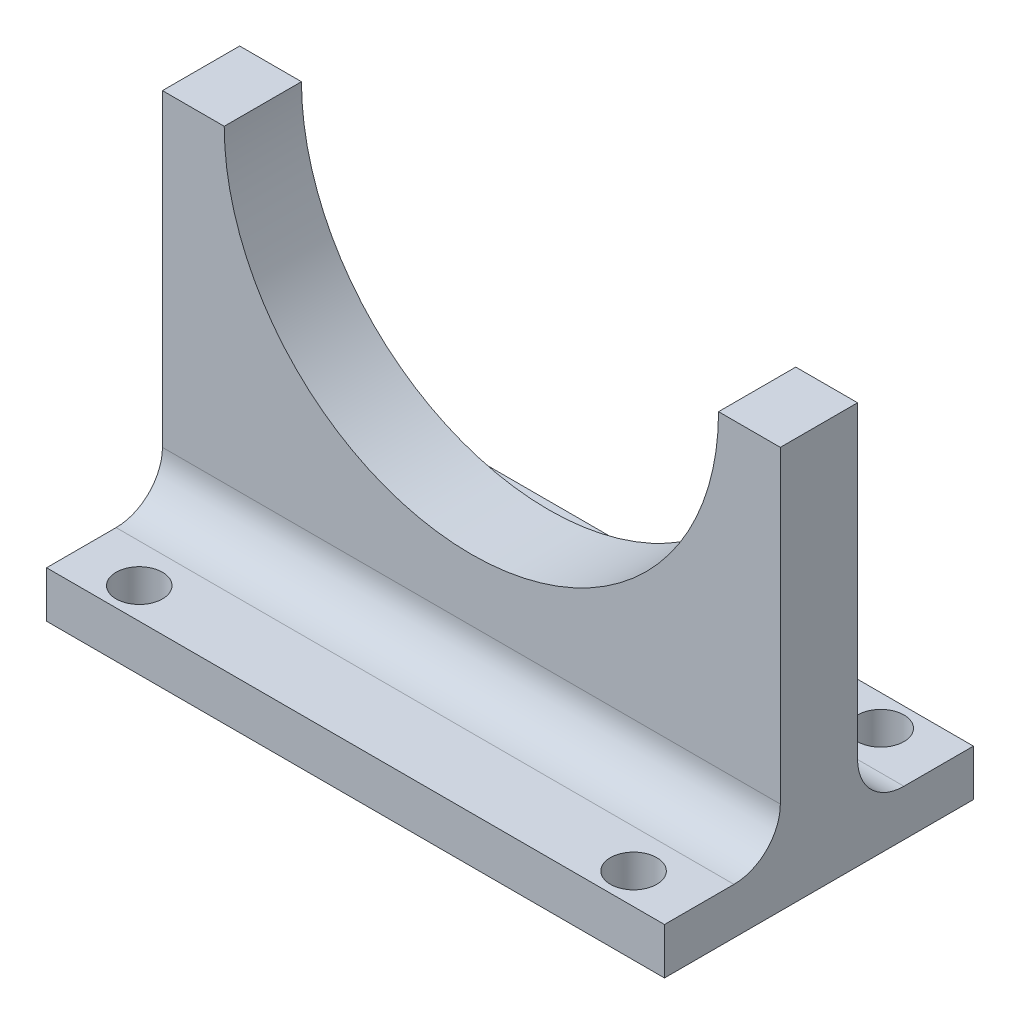
ISO-10303-21;
HEADER;
FILE_DESCRIPTION(('STEP AP214'),'2;1');
FILE_NAME('part.step','',(''),(''),'','','');
FILE_SCHEMA(('AUTOMOTIVE_DESIGN { 1 0 10303 214 1 1 1 1 }'));
ENDSEC;
DATA;
#1=APPLICATION_CONTEXT('core data for automotive mechanical design processes');
#2=APPLICATION_PROTOCOL_DEFINITION('international standard','automotive_design',2000,#1);
#3=PRODUCT_CONTEXT('',#1,'mechanical');
#4=PRODUCT('Part','Part','',(#3));
#5=PRODUCT_RELATED_PRODUCT_CATEGORY('part','',(#4));
#6=PRODUCT_DEFINITION_FORMATION('','',#4);
#7=PRODUCT_DEFINITION_CONTEXT('part definition',#1,'design');
#8=PRODUCT_DEFINITION('design','',#6,#7);
#9=PRODUCT_DEFINITION_SHAPE('','',#8);
#10=(LENGTH_UNIT() NAMED_UNIT(*) SI_UNIT(.MILLI.,.METRE.));
#11=(NAMED_UNIT(*) PLANE_ANGLE_UNIT() SI_UNIT($,.RADIAN.));
#12=(NAMED_UNIT(*) SI_UNIT($,.STERADIAN.) SOLID_ANGLE_UNIT());
#13=UNCERTAINTY_MEASURE_WITH_UNIT(LENGTH_MEASURE(1.E-05),#10,'distance_accuracy_value','');
#14=(GEOMETRIC_REPRESENTATION_CONTEXT(3) GLOBAL_UNCERTAINTY_ASSIGNED_CONTEXT((#13)) GLOBAL_UNIT_ASSIGNED_CONTEXT((#10,
#11,#12)) REPRESENTATION_CONTEXT('',''));
#15=CARTESIAN_POINT('',(0.,0.,0.));
#16=DIRECTION('',(0.,0.,1.));
#17=DIRECTION('',(1.,0.,0.));
#18=AXIS2_PLACEMENT_3D('',#15,#16,#17);
#19=CARTESIAN_POINT('',(-20.,13.,-2.5));
#20=DIRECTION('',(0.,1.,0.));
#21=DIRECTION('',(0.,0.,1.));
#22=AXIS2_PLACEMENT_3D('',#19,#20,#21);
#23=PLANE('',#22);
#24=DIRECTION('',(0.,0.,-1.));
#25=VECTOR('',#24,1.);
#26=CARTESIAN_POINT('',(16.,13.,2.5));
#27=LINE('',#26,#25);
#28=CARTESIAN_POINT('',(16.,13.,2.5));
#29=VERTEX_POINT('',#28);
#30=CARTESIAN_POINT('',(16.,13.,-2.5));
#31=VERTEX_POINT('',#30);
#32=EDGE_CURVE('E176',#29,#31,#27,.T.);
#33=ORIENTED_EDGE('',*,*,#32,.F.);
#34=DIRECTION('',(-1.,0.,0.));
#35=VECTOR('',#34,1.);
#36=CARTESIAN_POINT('',(-20.,13.,2.5));
#37=LINE('',#36,#35);
#38=CARTESIAN_POINT('',(20.,13.,2.5));
#39=VERTEX_POINT('',#38);
#40=EDGE_CURVE('E181',#39,#29,#37,.T.);
#41=ORIENTED_EDGE('',*,*,#40,.F.);
#42=DIRECTION('',(0.,0.,1.));
#43=VECTOR('',#42,1.);
#44=CARTESIAN_POINT('',(20.,13.,-2.5));
#45=LINE('',#44,#43);
#46=CARTESIAN_POINT('',(20.,13.,-2.5));
#47=VERTEX_POINT('',#46);
#48=EDGE_CURVE('E194',#47,#39,#45,.T.);
#49=ORIENTED_EDGE('',*,*,#48,.F.);
#50=DIRECTION('',(-1.,0.,0.));
#51=VECTOR('',#50,1.);
#52=CARTESIAN_POINT('',(-20.,13.,-2.5));
#53=LINE('',#52,#51);
#54=EDGE_CURVE('E189',#47,#31,#53,.T.);
#55=ORIENTED_EDGE('',*,*,#54,.T.);
#56=EDGE_LOOP('',(#33,#41,#49,#55));
#57=FACE_BOUND('',#56,.T.);
#58=ADVANCED_FACE('F33',(#57),#23,.T.);
#59=CARTESIAN_POINT('',(20.,13.,-2.5));
#60=DIRECTION('',(1.,0.,0.));
#61=DIRECTION('',(0.,1.,0.));
#62=AXIS2_PLACEMENT_3D('',#59,#60,#61);
#63=PLANE('',#62);
#64=DIRECTION('',(0.,1.,0.));
#65=VECTOR('',#64,1.);
#66=CARTESIAN_POINT('',(20.,13.,2.5));
#67=LINE('',#66,#65);
#68=CARTESIAN_POINT('',(20.,-6.99999999999999,2.5));
#69=VERTEX_POINT('',#68);
#70=EDGE_CURVE('E178',#69,#39,#67,.T.);
#71=ORIENTED_EDGE('',*,*,#70,.F.);
#72=CARTESIAN_POINT('',(20.,-7.,5.5));
#73=DIRECTION('',(1.,0.,0.));
#74=DIRECTION('',(0.,1.,0.));
#75=AXIS2_PLACEMENT_3D('',#72,#73,#74);
#76=CIRCLE('',#75,3.);
#77=CARTESIAN_POINT('',(20.,-10.,5.5));
#78=VERTEX_POINT('',#77);
#79=EDGE_CURVE('E11',#69,#78,#76,.F.);
#80=ORIENTED_EDGE('',*,*,#79,.T.);
#81=DIRECTION('',(0.,0.,1.));
#82=VECTOR('',#81,1.);
#83=CARTESIAN_POINT('',(20.,-10.,-10.));
#84=LINE('',#83,#82);
#85=CARTESIAN_POINT('',(20.,-10.,10.));
#86=VERTEX_POINT('',#85);
#87=EDGE_CURVE('E164',#78,#86,#84,.T.);
#88=ORIENTED_EDGE('',*,*,#87,.T.);
#89=DIRECTION('',(0.,1.,0.));
#90=VECTOR('',#89,1.);
#91=CARTESIAN_POINT('',(20.,-10.,10.));
#92=LINE('',#91,#90);
#93=CARTESIAN_POINT('',(20.,-13.,10.));
#94=VERTEX_POINT('',#93);
#95=EDGE_CURVE('E140',#94,#86,#92,.T.);
#96=ORIENTED_EDGE('',*,*,#95,.F.);
#97=DIRECTION('',(0.,0.,1.));
#98=VECTOR('',#97,1.);
#99=CARTESIAN_POINT('',(20.,-13.,-2.5));
#100=LINE('',#99,#98);
#101=CARTESIAN_POINT('',(20.,-13.,-10.));
#102=VERTEX_POINT('',#101);
#103=EDGE_CURVE('E131',#102,#94,#100,.T.);
#104=ORIENTED_EDGE('',*,*,#103,.F.);
#105=DIRECTION('',(0.,1.,0.));
#106=VECTOR('',#105,1.);
#107=CARTESIAN_POINT('',(20.,-10.,-10.));
#108=LINE('',#107,#106);
#109=CARTESIAN_POINT('',(20.,-10.,-10.));
#110=VERTEX_POINT('',#109);
#111=EDGE_CURVE('E158',#102,#110,#108,.T.);
#112=ORIENTED_EDGE('',*,*,#111,.T.);
#113=CARTESIAN_POINT('',(20.,-10.,-5.5));
#114=VERTEX_POINT('',#113);
#115=EDGE_CURVE('E170',#110,#114,#84,.T.);
#116=ORIENTED_EDGE('',*,*,#115,.T.);
#117=CARTESIAN_POINT('',(20.,-7.,-5.5));
#118=DIRECTION('',(1.,0.,0.));
#119=DIRECTION('',(0.,1.,0.));
#120=AXIS2_PLACEMENT_3D('',#117,#118,#119);
#121=CIRCLE('',#120,3.);
#122=CARTESIAN_POINT('',(20.,-6.99999999999999,-2.5));
#123=VERTEX_POINT('',#122);
#124=EDGE_CURVE('E213',#114,#123,#121,.F.);
#125=ORIENTED_EDGE('',*,*,#124,.T.);
#126=DIRECTION('',(0.,1.,0.));
#127=VECTOR('',#126,1.);
#128=CARTESIAN_POINT('',(20.,13.,-2.5));
#129=LINE('',#128,#127);
#130=EDGE_CURVE('E186',#123,#47,#129,.T.);
#131=ORIENTED_EDGE('',*,*,#130,.T.);
#132=ORIENTED_EDGE('',*,*,#48,.T.);
#133=EDGE_LOOP('',(#71,#80,#88,#96,#104,#112,#116,#125,#131,#132));
#134=FACE_BOUND('',#133,.T.);
#135=ADVANCED_FACE('F217',(#134),#63,.T.);
#136=CARTESIAN_POINT('',(-20.,-13.,-2.5));
#137=DIRECTION('',(0.,-1.,0.));
#138=DIRECTION('',(0.,0.,-1.));
#139=AXIS2_PLACEMENT_3D('',#136,#137,#138);
#140=PLANE('',#139);
#141=CARTESIAN_POINT('',(-16.,-13.,8.));
#142=DIRECTION('',(0.,1.,0.));
#143=DIRECTION('',(0.,0.,-1.));
#144=AXIS2_PLACEMENT_3D('',#141,#142,#143);
#145=CIRCLE('',#144,1.5);
#146=CARTESIAN_POINT('',(-16.,-13.,6.5));
#147=VERTEX_POINT('',#146);
#148=EDGE_CURVE('E363',#147,#147,#145,.T.);
#149=ORIENTED_EDGE('',*,*,#148,.T.);
#150=EDGE_LOOP('',(#149));
#151=FACE_BOUND('',#150,.T.);
#152=CARTESIAN_POINT('',(-16.,-13.,-8.));
#153=DIRECTION('',(0.,-1.,0.));
#154=DIRECTION('',(0.,0.,1.));
#155=AXIS2_PLACEMENT_3D('',#152,#153,#154);
#156=CIRCLE('',#155,1.5);
#157=CARTESIAN_POINT('',(-16.,-13.,-6.5));
#158=VERTEX_POINT('',#157);
#159=EDGE_CURVE('E371',#158,#158,#156,.T.);
#160=ORIENTED_EDGE('',*,*,#159,.F.);
#161=EDGE_LOOP('',(#160));
#162=FACE_BOUND('',#161,.T.);
#163=CARTESIAN_POINT('',(16.,-13.,8.));
#164=DIRECTION('',(0.,-1.,0.));
#165=DIRECTION('',(0.,0.,-1.));
#166=AXIS2_PLACEMENT_3D('',#163,#164,#165);
#167=CIRCLE('',#166,1.5);
#168=CARTESIAN_POINT('',(16.,-13.,6.5));
#169=VERTEX_POINT('',#168);
#170=EDGE_CURVE('E377',#169,#169,#167,.T.);
#171=ORIENTED_EDGE('',*,*,#170,.F.);
#172=EDGE_LOOP('',(#171));
#173=FACE_BOUND('',#172,.T.);
#174=CARTESIAN_POINT('',(16.,-13.,-8.));
#175=DIRECTION('',(0.,1.,0.));
#176=DIRECTION('',(0.,0.,1.));
#177=AXIS2_PLACEMENT_3D('',#174,#175,#176);
#178=CIRCLE('',#177,1.5);
#179=CARTESIAN_POINT('',(16.,-13.,-6.5));
#180=VERTEX_POINT('',#179);
#181=EDGE_CURVE('E146',#180,#180,#178,.T.);
#182=ORIENTED_EDGE('',*,*,#181,.T.);
#183=EDGE_LOOP('',(#182));
#184=FACE_BOUND('',#183,.T.);
#185=ORIENTED_EDGE('',*,*,#103,.T.);
#186=DIRECTION('',(1.,0.,0.));
#187=VECTOR('',#186,1.);
#188=CARTESIAN_POINT('',(-20.,-13.,10.));
#189=LINE('',#188,#187);
#190=CARTESIAN_POINT('',(-20.,-13.,10.));
#191=VERTEX_POINT('',#190);
#192=EDGE_CURVE('E135',#191,#94,#189,.T.);
#193=ORIENTED_EDGE('',*,*,#192,.F.);
#194=DIRECTION('',(0.,0.,1.));
#195=VECTOR('',#194,1.);
#196=CARTESIAN_POINT('',(-20.,-13.,-2.5));
#197=LINE('',#196,#195);
#198=CARTESIAN_POINT('',(-20.,-13.,-10.));
#199=VERTEX_POINT('',#198);
#200=EDGE_CURVE('E120',#199,#191,#197,.T.);
#201=ORIENTED_EDGE('',*,*,#200,.F.);
#202=DIRECTION('',(1.,0.,0.));
#203=VECTOR('',#202,1.);
#204=CARTESIAN_POINT('',(-20.,-13.,-10.));
#205=LINE('',#204,#203);
#206=EDGE_CURVE('E156',#199,#102,#205,.T.);
#207=ORIENTED_EDGE('',*,*,#206,.T.);
#208=EDGE_LOOP('',(#185,#193,#201,#207));
#209=FACE_BOUND('',#208,.T.);
#210=ADVANCED_FACE('F136',(#151,#162,#173,#184,#209),#140,.T.);
#211=CARTESIAN_POINT('',(-20.,13.,-2.5));
#212=DIRECTION('',(-1.,0.,0.));
#213=DIRECTION('',(0.,-1.,0.));
#214=AXIS2_PLACEMENT_3D('',#211,#212,#213);
#215=PLANE('',#214);
#216=DIRECTION('',(0.,-1.,0.));
#217=VECTOR('',#216,1.);
#218=CARTESIAN_POINT('',(-20.,13.,-2.5));
#219=LINE('',#218,#217);
#220=CARTESIAN_POINT('',(-20.,13.,-2.5));
#221=VERTEX_POINT('',#220);
#222=CARTESIAN_POINT('',(-20.,-6.99999999999999,-2.5));
#223=VERTEX_POINT('',#222);
#224=EDGE_CURVE('E192',#221,#223,#219,.T.);
#225=ORIENTED_EDGE('',*,*,#224,.T.);
#226=CARTESIAN_POINT('',(-20.,-7.,-5.5));
#227=DIRECTION('',(-1.,0.,0.));
#228=DIRECTION('',(0.,-1.,0.));
#229=AXIS2_PLACEMENT_3D('',#226,#227,#228);
#230=CIRCLE('',#229,3.);
#231=CARTESIAN_POINT('',(-20.,-10.,-5.5));
#232=VERTEX_POINT('',#231);
#233=EDGE_CURVE('E211',#223,#232,#230,.F.);
#234=ORIENTED_EDGE('',*,*,#233,.T.);
#235=DIRECTION('',(0.,0.,1.));
#236=VECTOR('',#235,1.);
#237=CARTESIAN_POINT('',(-20.,-10.,-10.));
#238=LINE('',#237,#236);
#239=CARTESIAN_POINT('',(-20.,-10.,-10.));
#240=VERTEX_POINT('',#239);
#241=EDGE_CURVE('E165',#240,#232,#238,.T.);
#242=ORIENTED_EDGE('',*,*,#241,.F.);
#243=DIRECTION('',(0.,-1.,0.));
#244=VECTOR('',#243,1.);
#245=CARTESIAN_POINT('',(-20.,-10.,-10.));
#246=LINE('',#245,#244);
#247=EDGE_CURVE('E127',#240,#199,#246,.T.);
#248=ORIENTED_EDGE('',*,*,#247,.T.);
#249=ORIENTED_EDGE('',*,*,#200,.T.);
#250=DIRECTION('',(0.,-1.,0.));
#251=VECTOR('',#250,1.);
#252=CARTESIAN_POINT('',(-20.,-10.,10.));
#253=LINE('',#252,#251);
#254=CARTESIAN_POINT('',(-20.,-10.,10.));
#255=VERTEX_POINT('',#254);
#256=EDGE_CURVE('E125',#255,#191,#253,.T.);
#257=ORIENTED_EDGE('',*,*,#256,.F.);
#258=CARTESIAN_POINT('',(-20.,-10.,5.5));
#259=VERTEX_POINT('',#258);
#260=EDGE_CURVE('E169',#259,#255,#238,.T.);
#261=ORIENTED_EDGE('',*,*,#260,.F.);
#262=CARTESIAN_POINT('',(-20.,-7.,5.5));
#263=DIRECTION('',(-1.,0.,0.));
#264=DIRECTION('',(0.,-1.,0.));
#265=AXIS2_PLACEMENT_3D('',#262,#263,#264);
#266=CIRCLE('',#265,3.);
#267=CARTESIAN_POINT('',(-20.,-6.99999999999999,2.5));
#268=VERTEX_POINT('',#267);
#269=EDGE_CURVE('E41',#259,#268,#266,.F.);
#270=ORIENTED_EDGE('',*,*,#269,.T.);
#271=DIRECTION('',(0.,-1.,0.));
#272=VECTOR('',#271,1.);
#273=CARTESIAN_POINT('',(-20.,13.,2.5));
#274=LINE('',#273,#272);
#275=CARTESIAN_POINT('',(-20.,13.,2.5));
#276=VERTEX_POINT('',#275);
#277=EDGE_CURVE('E184',#276,#268,#274,.T.);
#278=ORIENTED_EDGE('',*,*,#277,.F.);
#279=DIRECTION('',(0.,0.,1.));
#280=VECTOR('',#279,1.);
#281=CARTESIAN_POINT('',(-20.,13.,-2.5));
#282=LINE('',#281,#280);
#283=EDGE_CURVE('E132',#221,#276,#282,.T.);
#284=ORIENTED_EDGE('',*,*,#283,.F.);
#285=EDGE_LOOP('',(#225,#234,#242,#248,#249,#257,#261,#270,#278,#284));
#286=FACE_BOUND('',#285,.T.);
#287=ADVANCED_FACE('F123',(#286),#215,.T.);
#288=DIRECTION('',(0.,0.,-1.));
#289=VECTOR('',#288,1.);
#290=CARTESIAN_POINT('',(-16.,13.,2.5));
#291=LINE('',#290,#289);
#292=CARTESIAN_POINT('',(-16.,13.,-2.5));
#293=VERTEX_POINT('',#292);
#294=CARTESIAN_POINT('',(-16.,13.,2.5));
#295=VERTEX_POINT('',#294);
#296=EDGE_CURVE('E174',#293,#295,#291,.F.);
#297=ORIENTED_EDGE('',*,*,#296,.F.);
#298=EDGE_CURVE('E188',#293,#221,#53,.T.);
#299=ORIENTED_EDGE('',*,*,#298,.T.);
#300=ORIENTED_EDGE('',*,*,#283,.T.);
#301=EDGE_CURVE('E180',#295,#276,#37,.T.);
#302=ORIENTED_EDGE('',*,*,#301,.F.);
#303=EDGE_LOOP('',(#297,#299,#300,#302));
#304=FACE_BOUND('',#303,.T.);
#305=ADVANCED_FACE('F252',(#304),#23,.T.);
#306=CARTESIAN_POINT('',(0.,0.,-2.5));
#307=DIRECTION('',(0.,0.,1.));
#308=DIRECTION('',(1.,0.,0.));
#309=AXIS2_PLACEMENT_3D('',#306,#307,#308);
#310=PLANE('',#309);
#311=ORIENTED_EDGE('',*,*,#130,.F.);
#312=DIRECTION('',(-1.,0.,0.));
#313=VECTOR('',#312,1.);
#314=CARTESIAN_POINT('',(0.,-7.,-2.5));
#315=LINE('',#314,#313);
#316=EDGE_CURVE('E202',#123,#223,#315,.T.);
#317=ORIENTED_EDGE('',*,*,#316,.T.);
#318=ORIENTED_EDGE('',*,*,#224,.F.);
#319=ORIENTED_EDGE('',*,*,#298,.F.);
#320=CARTESIAN_POINT('',(0.,13.,-2.5));
#321=DIRECTION('',(0.,0.,-1.));
#322=DIRECTION('',(-1.,0.,0.));
#323=AXIS2_PLACEMENT_3D('',#320,#321,#322);
#324=CIRCLE('',#323,16.);
#325=EDGE_CURVE('E168',#31,#293,#324,.T.);
#326=ORIENTED_EDGE('',*,*,#325,.F.);
#327=ORIENTED_EDGE('',*,*,#54,.F.);
#328=EDGE_LOOP('',(#311,#317,#318,#319,#326,#327));
#329=FACE_BOUND('',#328,.T.);
#330=ADVANCED_FACE('F224',(#329),#310,.F.);
#331=CARTESIAN_POINT('',(0.,0.,2.5));
#332=DIRECTION('',(0.,0.,1.));
#333=DIRECTION('',(1.,0.,0.));
#334=AXIS2_PLACEMENT_3D('',#331,#332,#333);
#335=PLANE('',#334);
#336=ORIENTED_EDGE('',*,*,#277,.T.);
#337=DIRECTION('',(-1.,0.,0.));
#338=VECTOR('',#337,1.);
#339=CARTESIAN_POINT('',(20.,-7.,2.5));
#340=LINE('',#339,#338);
#341=EDGE_CURVE('E54',#268,#69,#340,.F.);
#342=ORIENTED_EDGE('',*,*,#341,.T.);
#343=ORIENTED_EDGE('',*,*,#70,.T.);
#344=ORIENTED_EDGE('',*,*,#40,.T.);
#345=CARTESIAN_POINT('',(0.,13.,2.5));
#346=DIRECTION('',(0.,0.,1.));
#347=DIRECTION('',(1.,0.,0.));
#348=AXIS2_PLACEMENT_3D('',#345,#346,#347);
#349=CIRCLE('',#348,16.);
#350=EDGE_CURVE('E195',#295,#29,#349,.T.);
#351=ORIENTED_EDGE('',*,*,#350,.F.);
#352=ORIENTED_EDGE('',*,*,#301,.T.);
#353=EDGE_LOOP('',(#336,#342,#343,#344,#351,#352));
#354=FACE_BOUND('',#353,.T.);
#355=ADVANCED_FACE('F242',(#354),#335,.T.);
#356=CARTESIAN_POINT('',(0.,13.,2.5));
#357=DIRECTION('',(0.,0.,-1.));
#358=DIRECTION('',(-1.,0.,0.));
#359=AXIS2_PLACEMENT_3D('',#356,#357,#358);
#360=CYLINDRICAL_SURFACE('',#359,16.);
#361=ORIENTED_EDGE('',*,*,#32,.T.);
#362=ORIENTED_EDGE('',*,*,#325,.T.);
#363=ORIENTED_EDGE('',*,*,#296,.T.);
#364=ORIENTED_EDGE('',*,*,#350,.T.);
#365=EDGE_LOOP('',(#361,#362,#363,#364));
#366=FACE_BOUND('',#365,.T.);
#367=ADVANCED_FACE('F248',(#366),#360,.F.);
#368=CARTESIAN_POINT('',(0.,0.,10.));
#369=DIRECTION('',(0.,0.,1.));
#370=DIRECTION('',(1.,0.,0.));
#371=AXIS2_PLACEMENT_3D('',#368,#369,#370);
#372=PLANE('',#371);
#373=ORIENTED_EDGE('',*,*,#256,.T.);
#374=ORIENTED_EDGE('',*,*,#192,.T.);
#375=ORIENTED_EDGE('',*,*,#95,.T.);
#376=DIRECTION('',(-1.,0.,0.));
#377=VECTOR('',#376,1.);
#378=CARTESIAN_POINT('',(-20.,-10.,10.));
#379=LINE('',#378,#377);
#380=EDGE_CURVE('E145',#86,#255,#379,.T.);
#381=ORIENTED_EDGE('',*,*,#380,.T.);
#382=EDGE_LOOP('',(#373,#374,#375,#381));
#383=FACE_BOUND('',#382,.T.);
#384=ADVANCED_FACE('F143',(#383),#372,.T.);
#385=CARTESIAN_POINT('',(-20.,-10.,-10.));
#386=DIRECTION('',(0.,1.,0.));
#387=DIRECTION('',(0.,0.,1.));
#388=AXIS2_PLACEMENT_3D('',#385,#386,#387);
#389=PLANE('',#388);
#390=CARTESIAN_POINT('',(-16.,-10.,8.));
#391=DIRECTION('',(0.,1.,0.));
#392=DIRECTION('',(0.,0.,-1.));
#393=AXIS2_PLACEMENT_3D('',#390,#391,#392);
#394=CIRCLE('',#393,1.5);
#395=CARTESIAN_POINT('',(-16.,-10.,6.5));
#396=VERTEX_POINT('',#395);
#397=EDGE_CURVE('E366',#396,#396,#394,.T.);
#398=ORIENTED_EDGE('',*,*,#397,.F.);
#399=EDGE_LOOP('',(#398));
#400=FACE_BOUND('',#399,.T.);
#401=CARTESIAN_POINT('',(16.,-10.,8.));
#402=DIRECTION('',(0.,-1.,0.));
#403=DIRECTION('',(0.,0.,-1.));
#404=AXIS2_PLACEMENT_3D('',#401,#402,#403);
#405=CIRCLE('',#404,1.5);
#406=CARTESIAN_POINT('',(16.,-10.,6.5));
#407=VERTEX_POINT('',#406);
#408=EDGE_CURVE('E374',#407,#407,#405,.T.);
#409=ORIENTED_EDGE('',*,*,#408,.T.);
#410=EDGE_LOOP('',(#409));
#411=FACE_BOUND('',#410,.T.);
#412=ORIENTED_EDGE('',*,*,#87,.F.);
#413=DIRECTION('',(-1.,0.,0.));
#414=VECTOR('',#413,1.);
#415=CARTESIAN_POINT('',(-20.,-10.,5.5));
#416=LINE('',#415,#414);
#417=EDGE_CURVE('E207',#78,#259,#416,.T.);
#418=ORIENTED_EDGE('',*,*,#417,.T.);
#419=ORIENTED_EDGE('',*,*,#260,.T.);
#420=ORIENTED_EDGE('',*,*,#380,.F.);
#421=EDGE_LOOP('',(#412,#418,#419,#420));
#422=FACE_BOUND('',#421,.T.);
#423=ADVANCED_FACE('F237',(#400,#411,#422),#389,.T.);
#424=CARTESIAN_POINT('',(-16.,-10.,-8.));
#425=DIRECTION('',(0.,-1.,0.));
#426=DIRECTION('',(0.,0.,1.));
#427=AXIS2_PLACEMENT_3D('',#424,#425,#426);
#428=CIRCLE('',#427,1.5);
#429=CARTESIAN_POINT('',(-16.,-10.,-6.5));
#430=VERTEX_POINT('',#429);
#431=EDGE_CURVE('E368',#430,#430,#428,.T.);
#432=ORIENTED_EDGE('',*,*,#431,.T.);
#433=EDGE_LOOP('',(#432));
#434=FACE_BOUND('',#433,.T.);
#435=CARTESIAN_POINT('',(16.,-10.,-8.));
#436=DIRECTION('',(0.,1.,0.));
#437=DIRECTION('',(0.,0.,1.));
#438=AXIS2_PLACEMENT_3D('',#435,#436,#437);
#439=CIRCLE('',#438,1.5);
#440=CARTESIAN_POINT('',(16.,-10.,-6.5));
#441=VERTEX_POINT('',#440);
#442=EDGE_CURVE('E149',#441,#441,#439,.T.);
#443=ORIENTED_EDGE('',*,*,#442,.F.);
#444=EDGE_LOOP('',(#443));
#445=FACE_BOUND('',#444,.T.);
#446=ORIENTED_EDGE('',*,*,#241,.T.);
#447=DIRECTION('',(-1.,0.,0.));
#448=VECTOR('',#447,1.);
#449=CARTESIAN_POINT('',(-20.,-10.,-5.5));
#450=LINE('',#449,#448);
#451=EDGE_CURVE('E205',#232,#114,#450,.F.);
#452=ORIENTED_EDGE('',*,*,#451,.T.);
#453=ORIENTED_EDGE('',*,*,#115,.F.);
#454=DIRECTION('',(-1.,0.,0.));
#455=VECTOR('',#454,1.);
#456=CARTESIAN_POINT('',(-20.,-10.,-10.));
#457=LINE('',#456,#455);
#458=EDGE_CURVE('E161',#110,#240,#457,.T.);
#459=ORIENTED_EDGE('',*,*,#458,.T.);
#460=EDGE_LOOP('',(#446,#452,#453,#459));
#461=FACE_BOUND('',#460,.T.);
#462=ADVANCED_FACE('F230',(#434,#445,#461),#389,.T.);
#463=CARTESIAN_POINT('',(0.,0.,-10.));
#464=DIRECTION('',(0.,0.,1.));
#465=DIRECTION('',(1.,0.,0.));
#466=AXIS2_PLACEMENT_3D('',#463,#464,#465);
#467=PLANE('',#466);
#468=ORIENTED_EDGE('',*,*,#247,.F.);
#469=ORIENTED_EDGE('',*,*,#458,.F.);
#470=ORIENTED_EDGE('',*,*,#111,.F.);
#471=ORIENTED_EDGE('',*,*,#206,.F.);
#472=EDGE_LOOP('',(#468,#469,#470,#471));
#473=FACE_BOUND('',#472,.T.);
#474=ADVANCED_FACE('F234',(#473),#467,.F.);
#475=CARTESIAN_POINT('',(0.,-7.,-5.5));
#476=DIRECTION('',(-1.,0.,0.));
#477=DIRECTION('',(0.,0.,1.));
#478=AXIS2_PLACEMENT_3D('',#475,#476,#477);
#479=CYLINDRICAL_SURFACE('',#478,3.);
#480=ORIENTED_EDGE('',*,*,#124,.F.);
#481=ORIENTED_EDGE('',*,*,#451,.F.);
#482=ORIENTED_EDGE('',*,*,#233,.F.);
#483=ORIENTED_EDGE('',*,*,#316,.F.);
#484=EDGE_LOOP('',(#480,#481,#482,#483));
#485=FACE_BOUND('',#484,.T.);
#486=ADVANCED_FACE('F227',(#485),#479,.F.);
#487=CARTESIAN_POINT('',(-20.,-7.,5.5));
#488=DIRECTION('',(1.,0.,0.));
#489=DIRECTION('',(0.,0.,-1.));
#490=AXIS2_PLACEMENT_3D('',#487,#488,#489);
#491=CYLINDRICAL_SURFACE('',#490,3.);
#492=ORIENTED_EDGE('',*,*,#79,.F.);
#493=ORIENTED_EDGE('',*,*,#341,.F.);
#494=ORIENTED_EDGE('',*,*,#269,.F.);
#495=ORIENTED_EDGE('',*,*,#417,.F.);
#496=EDGE_LOOP('',(#492,#493,#494,#495));
#497=FACE_BOUND('',#496,.T.);
#498=ADVANCED_FACE('F35',(#497),#491,.F.);
#499=CARTESIAN_POINT('',(16.,-13.,-8.));
#500=DIRECTION('',(0.,1.,0.));
#501=DIRECTION('',(0.,0.,1.));
#502=AXIS2_PLACEMENT_3D('',#499,#500,#501);
#503=CYLINDRICAL_SURFACE('',#502,1.5);
#504=ORIENTED_EDGE('',*,*,#181,.F.);
#505=EDGE_LOOP('',(#504));
#506=FACE_BOUND('',#505,.T.);
#507=ORIENTED_EDGE('',*,*,#442,.T.);
#508=EDGE_LOOP('',(#507));
#509=FACE_BOUND('',#508,.T.);
#510=ADVANCED_FACE('F279',(#506,#509),#503,.F.);
#511=CARTESIAN_POINT('',(16.,-13.,8.));
#512=DIRECTION('',(0.,1.,0.));
#513=DIRECTION('',(0.,0.,1.));
#514=AXIS2_PLACEMENT_3D('',#511,#512,#513);
#515=CYLINDRICAL_SURFACE('',#514,1.5);
#516=ORIENTED_EDGE('',*,*,#170,.T.);
#517=EDGE_LOOP('',(#516));
#518=FACE_BOUND('',#517,.T.);
#519=ORIENTED_EDGE('',*,*,#408,.F.);
#520=EDGE_LOOP('',(#519));
#521=FACE_BOUND('',#520,.T.);
#522=ADVANCED_FACE('F315',(#518,#521),#515,.F.);
#523=CARTESIAN_POINT('',(-16.,-13.,-8.));
#524=DIRECTION('',(0.,1.,0.));
#525=DIRECTION('',(0.,0.,1.));
#526=AXIS2_PLACEMENT_3D('',#523,#524,#525);
#527=CYLINDRICAL_SURFACE('',#526,1.5);
#528=ORIENTED_EDGE('',*,*,#159,.T.);
#529=EDGE_LOOP('',(#528));
#530=FACE_BOUND('',#529,.T.);
#531=ORIENTED_EDGE('',*,*,#431,.F.);
#532=EDGE_LOOP('',(#531));
#533=FACE_BOUND('',#532,.T.);
#534=ADVANCED_FACE('F323',(#530,#533),#527,.F.);
#535=CARTESIAN_POINT('',(-16.,-13.,8.));
#536=DIRECTION('',(0.,1.,0.));
#537=DIRECTION('',(0.,0.,1.));
#538=AXIS2_PLACEMENT_3D('',#535,#536,#537);
#539=CYLINDRICAL_SURFACE('',#538,1.5);
#540=ORIENTED_EDGE('',*,*,#148,.F.);
#541=EDGE_LOOP('',(#540));
#542=FACE_BOUND('',#541,.T.);
#543=ORIENTED_EDGE('',*,*,#397,.T.);
#544=EDGE_LOOP('',(#543));
#545=FACE_BOUND('',#544,.T.);
#546=ADVANCED_FACE('F346',(#542,#545),#539,.F.);
#547=CLOSED_SHELL('',(#58,#135,#210,#287,#305,#330,#355,#367,#384,#423,#462,#474,#486,#498,#510,
#522,#534,#546));
#548=MANIFOLD_SOLID_BREP('B2',#547);
#549=ADVANCED_BREP_SHAPE_REPRESENTATION('',(#18,#548),#14);
#550=SHAPE_DEFINITION_REPRESENTATION(#9,#549);
ENDSEC;
END-ISO-10303-21;
